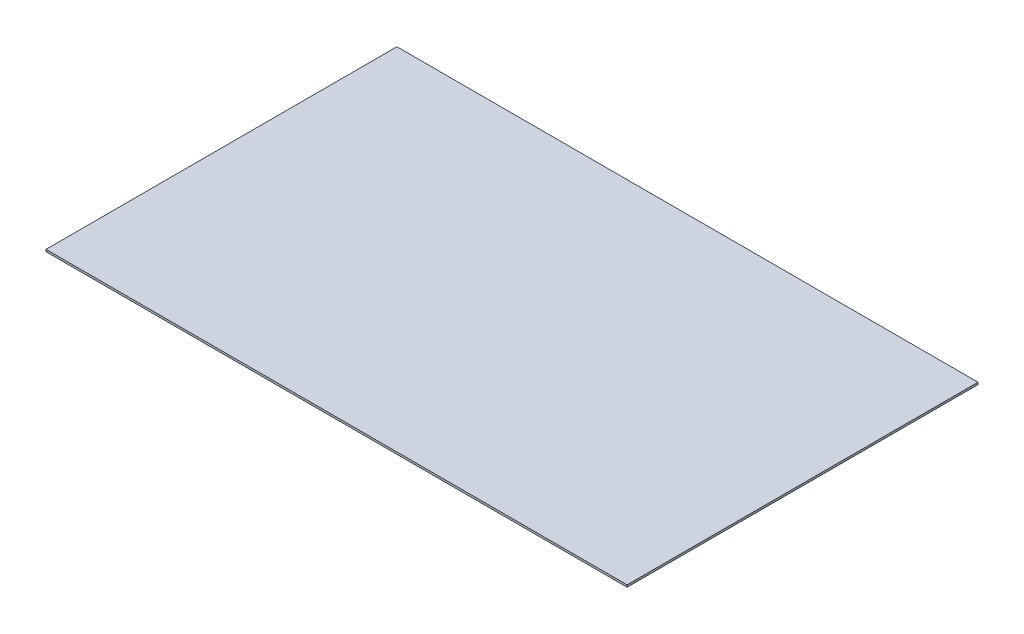
ISO-10303-21;
HEADER;
FILE_DESCRIPTION(('STEP AP214'),'2;1');
FILE_NAME('part.step','',(''),(''),'','','');
FILE_SCHEMA(('AUTOMOTIVE_DESIGN { 1 0 10303 214 1 1 1 1 }'));
ENDSEC;
DATA;
#1=APPLICATION_CONTEXT('core data for automotive mechanical design processes');
#2=APPLICATION_PROTOCOL_DEFINITION('international standard','automotive_design',2000,#1);
#3=PRODUCT_CONTEXT('',#1,'mechanical');
#4=PRODUCT('Part','Part','',(#3));
#5=PRODUCT_RELATED_PRODUCT_CATEGORY('part','',(#4));
#6=PRODUCT_DEFINITION_FORMATION('','',#4);
#7=PRODUCT_DEFINITION_CONTEXT('part definition',#1,'design');
#8=PRODUCT_DEFINITION('design','',#6,#7);
#9=PRODUCT_DEFINITION_SHAPE('','',#8);
#10=(LENGTH_UNIT() NAMED_UNIT(*) SI_UNIT(.MILLI.,.METRE.));
#11=(NAMED_UNIT(*) PLANE_ANGLE_UNIT() SI_UNIT($,.RADIAN.));
#12=(NAMED_UNIT(*) SI_UNIT($,.STERADIAN.) SOLID_ANGLE_UNIT());
#13=UNCERTAINTY_MEASURE_WITH_UNIT(LENGTH_MEASURE(1.E-05),#10,'distance_accuracy_value','');
#14=(GEOMETRIC_REPRESENTATION_CONTEXT(3) GLOBAL_UNCERTAINTY_ASSIGNED_CONTEXT((#13)) GLOBAL_UNIT_ASSIGNED_CONTEXT((#10,
#11,#12)) REPRESENTATION_CONTEXT('',''));
#15=CARTESIAN_POINT('',(0.,0.,0.));
#16=DIRECTION('',(0.,0.,1.));
#17=DIRECTION('',(1.,0.,0.));
#18=AXIS2_PLACEMENT_3D('',#15,#16,#17);
#19=CARTESIAN_POINT('',(0.,3.,0.));
#20=DIRECTION('',(-1.,0.,0.));
#21=DIRECTION('',(0.,0.,1.));
#22=AXIS2_PLACEMENT_3D('',#19,#20,#21);
#23=PLANE('',#22);
#24=DIRECTION('',(0.,0.,-1.));
#25=VECTOR('',#24,1.);
#26=CARTESIAN_POINT('',(0.,0.,0.));
#27=LINE('',#26,#25);
#28=CARTESIAN_POINT('',(0.,0.,500.));
#29=VERTEX_POINT('',#28);
#30=CARTESIAN_POINT('',(0.,0.,0.));
#31=VERTEX_POINT('',#30);
#32=EDGE_CURVE('E96',#29,#31,#27,.T.);
#33=ORIENTED_EDGE('',*,*,#32,.T.);
#34=DIRECTION('',(0.,-1.,0.));
#35=VECTOR('',#34,1.);
#36=CARTESIAN_POINT('',(0.,3.,0.));
#37=LINE('',#36,#35);
#38=CARTESIAN_POINT('',(0.,3.,0.));
#39=VERTEX_POINT('',#38);
#40=EDGE_CURVE('E11',#39,#31,#37,.T.);
#41=ORIENTED_EDGE('',*,*,#40,.F.);
#42=DIRECTION('',(0.,0.,-1.));
#43=VECTOR('',#42,1.);
#44=CARTESIAN_POINT('',(0.,3.,0.));
#45=LINE('',#44,#43);
#46=CARTESIAN_POINT('',(0.,3.,500.));
#47=VERTEX_POINT('',#46);
#48=EDGE_CURVE('E84',#47,#39,#45,.T.);
#49=ORIENTED_EDGE('',*,*,#48,.F.);
#50=DIRECTION('',(0.,-1.,0.));
#51=VECTOR('',#50,1.);
#52=CARTESIAN_POINT('',(0.,3.,500.));
#53=LINE('',#52,#51);
#54=EDGE_CURVE('E92',#47,#29,#53,.T.);
#55=ORIENTED_EDGE('',*,*,#54,.T.);
#56=EDGE_LOOP('',(#33,#41,#49,#55));
#57=FACE_BOUND('',#56,.T.);
#58=ADVANCED_FACE('F33',(#57),#23,.F.);
#59=CARTESIAN_POINT('',(0.,3.,0.));
#60=DIRECTION('',(0.,0.,1.));
#61=DIRECTION('',(1.,0.,0.));
#62=AXIS2_PLACEMENT_3D('',#59,#60,#61);
#63=PLANE('',#62);
#64=DIRECTION('',(-1.,0.,0.));
#65=VECTOR('',#64,1.);
#66=CARTESIAN_POINT('',(0.,0.,0.));
#67=LINE('',#66,#65);
#68=CARTESIAN_POINT('',(-828.,0.,1.01400754969401E-13));
#69=VERTEX_POINT('',#68);
#70=EDGE_CURVE('E88',#31,#69,#67,.T.);
#71=ORIENTED_EDGE('',*,*,#70,.T.);
#72=DIRECTION('',(0.,-1.,0.));
#73=VECTOR('',#72,1.);
#74=CARTESIAN_POINT('',(-828.,3.,1.01400754969401E-13));
#75=LINE('',#74,#73);
#76=CARTESIAN_POINT('',(-828.,3.,1.01400754969401E-13));
#77=VERTEX_POINT('',#76);
#78=EDGE_CURVE('E41',#77,#69,#75,.T.);
#79=ORIENTED_EDGE('',*,*,#78,.F.);
#80=DIRECTION('',(-1.,0.,0.));
#81=VECTOR('',#80,1.);
#82=CARTESIAN_POINT('',(0.,3.,0.));
#83=LINE('',#82,#81);
#84=EDGE_CURVE('E79',#39,#77,#83,.T.);
#85=ORIENTED_EDGE('',*,*,#84,.F.);
#86=ORIENTED_EDGE('',*,*,#40,.T.);
#87=EDGE_LOOP('',(#71,#79,#85,#86));
#88=FACE_BOUND('',#87,.T.);
#89=ADVANCED_FACE('F87',(#88),#63,.F.);
#90=CARTESIAN_POINT('',(-828.,3.,1.01400754969401E-13));
#91=DIRECTION('',(1.,0.,0.));
#92=DIRECTION('',(0.,0.,-1.));
#93=AXIS2_PLACEMENT_3D('',#90,#91,#92);
#94=PLANE('',#93);
#95=DIRECTION('',(0.,0.,1.));
#96=VECTOR('',#95,1.);
#97=CARTESIAN_POINT('',(-828.,0.,1.01400754969401E-13));
#98=LINE('',#97,#96);
#99=CARTESIAN_POINT('',(-828.,0.,500.));
#100=VERTEX_POINT('',#99);
#101=EDGE_CURVE('E66',#69,#100,#98,.T.);
#102=ORIENTED_EDGE('',*,*,#101,.T.);
#103=DIRECTION('',(0.,-1.,0.));
#104=VECTOR('',#103,1.);
#105=CARTESIAN_POINT('',(-828.,3.,500.));
#106=LINE('',#105,#104);
#107=CARTESIAN_POINT('',(-828.,3.,500.));
#108=VERTEX_POINT('',#107);
#109=EDGE_CURVE('E89',#108,#100,#106,.T.);
#110=ORIENTED_EDGE('',*,*,#109,.F.);
#111=DIRECTION('',(0.,0.,1.));
#112=VECTOR('',#111,1.);
#113=CARTESIAN_POINT('',(-828.,3.,1.01400754969401E-13));
#114=LINE('',#113,#112);
#115=EDGE_CURVE('E82',#77,#108,#114,.T.);
#116=ORIENTED_EDGE('',*,*,#115,.F.);
#117=ORIENTED_EDGE('',*,*,#78,.T.);
#118=EDGE_LOOP('',(#102,#110,#116,#117));
#119=FACE_BOUND('',#118,.T.);
#120=ADVANCED_FACE('F90',(#119),#94,.F.);
#121=CARTESIAN_POINT('',(0.,3.,500.));
#122=DIRECTION('',(0.,0.,-1.));
#123=DIRECTION('',(-1.,0.,0.));
#124=AXIS2_PLACEMENT_3D('',#121,#122,#123);
#125=PLANE('',#124);
#126=DIRECTION('',(1.,0.,0.));
#127=VECTOR('',#126,1.);
#128=CARTESIAN_POINT('',(0.,0.,500.));
#129=LINE('',#128,#127);
#130=EDGE_CURVE('E72',#100,#29,#129,.T.);
#131=ORIENTED_EDGE('',*,*,#130,.T.);
#132=ORIENTED_EDGE('',*,*,#54,.F.);
#133=DIRECTION('',(1.,0.,0.));
#134=VECTOR('',#133,1.);
#135=CARTESIAN_POINT('',(0.,3.,500.));
#136=LINE('',#135,#134);
#137=EDGE_CURVE('E49',#108,#47,#136,.T.);
#138=ORIENTED_EDGE('',*,*,#137,.F.);
#139=ORIENTED_EDGE('',*,*,#109,.T.);
#140=EDGE_LOOP('',(#131,#132,#138,#139));
#141=FACE_BOUND('',#140,.T.);
#142=ADVANCED_FACE('F103',(#141),#125,.F.);
#143=CARTESIAN_POINT('',(0.,3.,0.));
#144=DIRECTION('',(0.,-1.,0.));
#145=DIRECTION('',(0.,0.,-1.));
#146=AXIS2_PLACEMENT_3D('',#143,#144,#145);
#147=PLANE('',#146);
#148=ORIENTED_EDGE('',*,*,#48,.T.);
#149=ORIENTED_EDGE('',*,*,#84,.T.);
#150=ORIENTED_EDGE('',*,*,#115,.T.);
#151=ORIENTED_EDGE('',*,*,#137,.T.);
#152=EDGE_LOOP('',(#148,#149,#150,#151));
#153=FACE_BOUND('',#152,.T.);
#154=ADVANCED_FACE('F80',(#153),#147,.F.);
#155=CARTESIAN_POINT('',(0.,0.,0.));
#156=DIRECTION('',(0.,-1.,0.));
#157=DIRECTION('',(0.,0.,-1.));
#158=AXIS2_PLACEMENT_3D('',#155,#156,#157);
#159=PLANE('',#158);
#160=ORIENTED_EDGE('',*,*,#32,.F.);
#161=ORIENTED_EDGE('',*,*,#130,.F.);
#162=ORIENTED_EDGE('',*,*,#101,.F.);
#163=ORIENTED_EDGE('',*,*,#70,.F.);
#164=EDGE_LOOP('',(#160,#161,#162,#163));
#165=FACE_BOUND('',#164,.T.);
#166=ADVANCED_FACE('F106',(#165),#159,.T.);
#167=CLOSED_SHELL('',(#58,#89,#120,#142,#154,#166));
#168=MANIFOLD_SOLID_BREP('B2',#167);
#169=ADVANCED_BREP_SHAPE_REPRESENTATION('',(#18,#168),#14);
#170=SHAPE_DEFINITION_REPRESENTATION(#9,#169);
ENDSEC;
END-ISO-10303-21;
